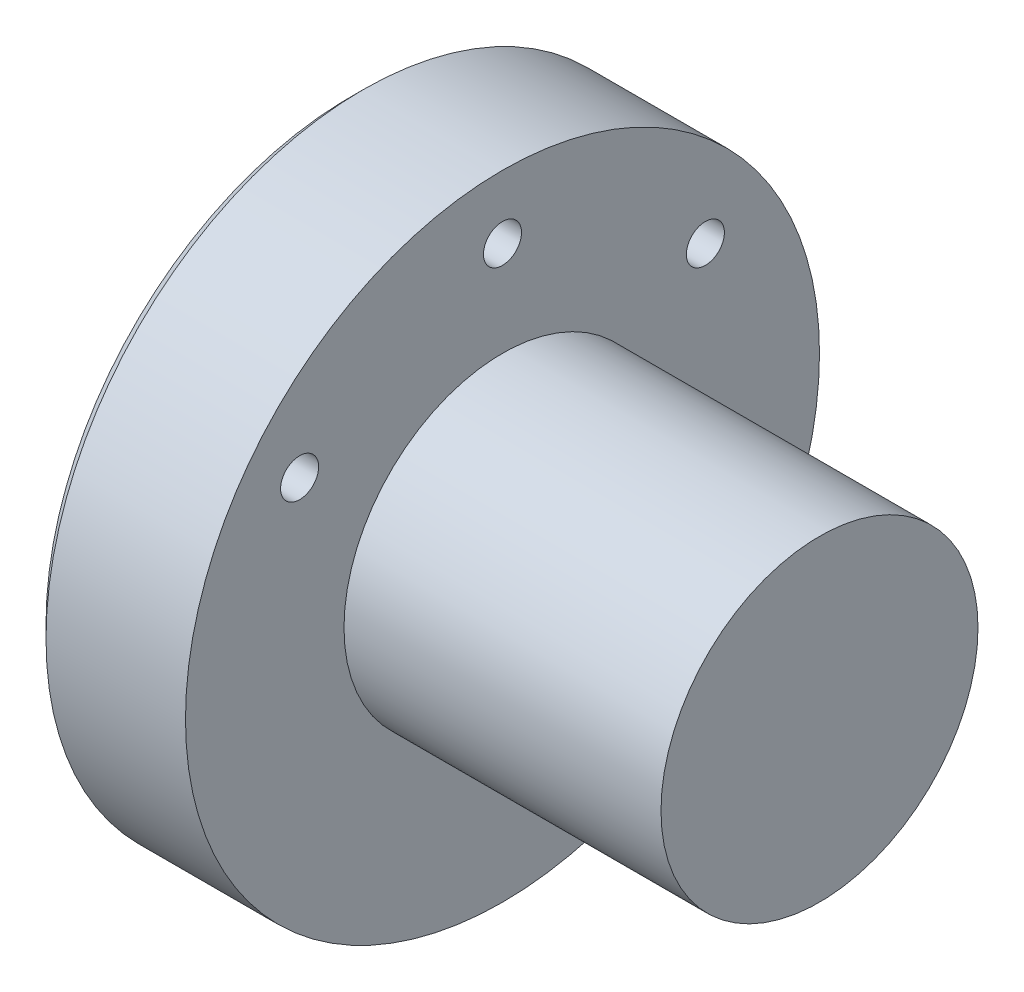
ISO-10303-21;
HEADER;
FILE_DESCRIPTION(('STEP AP214'),'2;1');
FILE_NAME('part.step','',(''),(''),'','','');
FILE_SCHEMA(('AUTOMOTIVE_DESIGN { 1 0 10303 214 1 1 1 1 }'));
ENDSEC;
DATA;
#1=APPLICATION_CONTEXT('core data for automotive mechanical design processes');
#2=APPLICATION_PROTOCOL_DEFINITION('international standard','automotive_design',2000,#1);
#3=PRODUCT_CONTEXT('',#1,'mechanical');
#4=PRODUCT('Part','Part','',(#3));
#5=PRODUCT_RELATED_PRODUCT_CATEGORY('part','',(#4));
#6=PRODUCT_DEFINITION_FORMATION('','',#4);
#7=PRODUCT_DEFINITION_CONTEXT('part definition',#1,'design');
#8=PRODUCT_DEFINITION('design','',#6,#7);
#9=PRODUCT_DEFINITION_SHAPE('','',#8);
#10=(LENGTH_UNIT() NAMED_UNIT(*) SI_UNIT(.MILLI.,.METRE.));
#11=(NAMED_UNIT(*) PLANE_ANGLE_UNIT() SI_UNIT($,.RADIAN.));
#12=(NAMED_UNIT(*) SI_UNIT($,.STERADIAN.) SOLID_ANGLE_UNIT());
#13=UNCERTAINTY_MEASURE_WITH_UNIT(LENGTH_MEASURE(1.E-05),#10,'distance_accuracy_value','');
#14=(GEOMETRIC_REPRESENTATION_CONTEXT(3) GLOBAL_UNCERTAINTY_ASSIGNED_CONTEXT((#13)) GLOBAL_UNIT_ASSIGNED_CONTEXT((#10,
#11,#12)) REPRESENTATION_CONTEXT('',''));
#15=CARTESIAN_POINT('',(0.,0.,0.));
#16=DIRECTION('',(0.,0.,1.));
#17=DIRECTION('',(1.,0.,0.));
#18=AXIS2_PLACEMENT_3D('',#15,#16,#17);
#19=CARTESIAN_POINT('',(0.,6.,0.));
#20=DIRECTION('',(1.,0.,0.));
#21=DIRECTION('',(0.,0.,-1.));
#22=AXIS2_PLACEMENT_3D('',#19,#20,#21);
#23=PLANE('',#22);
#24=CARTESIAN_POINT('',(0.,0.,0.));
#25=DIRECTION('',(1.,0.,0.));
#26=DIRECTION('',(0.,0.,-1.));
#27=AXIS2_PLACEMENT_3D('',#24,#25,#26);
#28=CIRCLE('',#27,5.);
#29=CARTESIAN_POINT('',(0.,0.,-5.));
#30=VERTEX_POINT('',#29);
#31=EDGE_CURVE('E80',#30,#30,#28,.F.);
#32=ORIENTED_EDGE('',*,*,#31,.T.);
#33=EDGE_LOOP('',(#32));
#34=FACE_BOUND('',#33,.T.);
#35=ADVANCED_FACE('F43',(#34),#23,.F.);
#36=CARTESIAN_POINT('',(40.,0.,0.));
#37=DIRECTION('',(-1.,0.,0.));
#38=DIRECTION('',(0.,0.,1.));
#39=AXIS2_PLACEMENT_3D('',#36,#37,#38);
#40=PLANE('',#39);
#41=CARTESIAN_POINT('',(40.,0.,0.));
#42=DIRECTION('',(-1.,0.,0.));
#43=DIRECTION('',(0.,0.,1.));
#44=AXIS2_PLACEMENT_3D('',#41,#42,#43);
#45=CIRCLE('',#44,12.5);
#46=CARTESIAN_POINT('',(40.,0.,12.5));
#47=VERTEX_POINT('',#46);
#48=EDGE_CURVE('E92',#47,#47,#45,.T.);
#49=ORIENTED_EDGE('',*,*,#48,.F.);
#50=EDGE_LOOP('',(#49));
#51=FACE_BOUND('',#50,.T.);
#52=ADVANCED_FACE('F141',(#51),#40,.F.);
#53=CARTESIAN_POINT('',(0.,0.,0.));
#54=DIRECTION('',(-1.,0.,0.));
#55=DIRECTION('',(0.,0.,1.));
#56=AXIS2_PLACEMENT_3D('',#53,#54,#55);
#57=CYLINDRICAL_SURFACE('',#56,12.5);
#58=CARTESIAN_POINT('',(15.,0.,0.));
#59=DIRECTION('',(-1.,0.,0.));
#60=DIRECTION('',(0.,0.,1.));
#61=AXIS2_PLACEMENT_3D('',#58,#59,#60);
#62=CIRCLE('',#61,12.5);
#63=CARTESIAN_POINT('',(15.,0.,12.5));
#64=VERTEX_POINT('',#63);
#65=EDGE_CURVE('E96',#64,#64,#62,.T.);
#66=ORIENTED_EDGE('',*,*,#65,.F.);
#67=EDGE_LOOP('',(#66));
#68=FACE_BOUND('',#67,.T.);
#69=ORIENTED_EDGE('',*,*,#48,.T.);
#70=EDGE_LOOP('',(#69));
#71=FACE_BOUND('',#70,.T.);
#72=ADVANCED_FACE('F147',(#68,#71),#57,.T.);
#73=CARTESIAN_POINT('',(15.,12.5,0.));
#74=DIRECTION('',(-1.,0.,0.));
#75=DIRECTION('',(0.,0.,1.));
#76=AXIS2_PLACEMENT_3D('',#73,#74,#75);
#77=PLANE('',#76);
#78=CARTESIAN_POINT('',(15.,12.,-16.));
#79=DIRECTION('',(-1.,0.,0.));
#80=DIRECTION('',(0.,0.,1.));
#81=AXIS2_PLACEMENT_3D('',#78,#79,#80);
#82=CIRCLE('',#81,1.5);
#83=CARTESIAN_POINT('',(15.,12.,-14.5));
#84=VERTEX_POINT('',#83);
#85=EDGE_CURVE('E108',#84,#84,#82,.T.);
#86=ORIENTED_EDGE('',*,*,#85,.T.);
#87=EDGE_LOOP('',(#86));
#88=FACE_BOUND('',#87,.T.);
#89=CARTESIAN_POINT('',(15.,20.,0.));
#90=DIRECTION('',(-1.,0.,0.));
#91=DIRECTION('',(0.,0.,1.));
#92=AXIS2_PLACEMENT_3D('',#89,#90,#91);
#93=CIRCLE('',#92,1.5);
#94=CARTESIAN_POINT('',(15.,20.,1.5));
#95=VERTEX_POINT('',#94);
#96=EDGE_CURVE('E112',#95,#95,#93,.T.);
#97=ORIENTED_EDGE('',*,*,#96,.T.);
#98=EDGE_LOOP('',(#97));
#99=FACE_BOUND('',#98,.T.);
#100=CARTESIAN_POINT('',(15.,12.,16.));
#101=DIRECTION('',(-1.,0.,0.));
#102=DIRECTION('',(0.,0.,1.));
#103=AXIS2_PLACEMENT_3D('',#100,#101,#102);
#104=CIRCLE('',#103,1.5);
#105=CARTESIAN_POINT('',(15.,12.,17.5));
#106=VERTEX_POINT('',#105);
#107=EDGE_CURVE('E116',#106,#106,#104,.T.);
#108=ORIENTED_EDGE('',*,*,#107,.T.);
#109=EDGE_LOOP('',(#108));
#110=FACE_BOUND('',#109,.T.);
#111=CARTESIAN_POINT('',(15.,0.,0.));
#112=DIRECTION('',(-1.,0.,0.));
#113=DIRECTION('',(0.,0.,1.));
#114=AXIS2_PLACEMENT_3D('',#111,#112,#113);
#115=CIRCLE('',#114,25.);
#116=CARTESIAN_POINT('',(15.,0.,25.));
#117=VERTEX_POINT('',#116);
#118=EDGE_CURVE('E100',#117,#117,#115,.T.);
#119=ORIENTED_EDGE('',*,*,#118,.F.);
#120=EDGE_LOOP('',(#119));
#121=FACE_BOUND('',#120,.T.);
#122=ORIENTED_EDGE('',*,*,#65,.T.);
#123=EDGE_LOOP('',(#122));
#124=FACE_BOUND('',#123,.T.);
#125=ADVANCED_FACE('F121',(#88,#99,#110,#121,#124),#77,.F.);
#126=CARTESIAN_POINT('',(0.,0.,0.));
#127=DIRECTION('',(-1.,0.,0.));
#128=DIRECTION('',(0.,0.,1.));
#129=AXIS2_PLACEMENT_3D('',#126,#127,#128);
#130=CYLINDRICAL_SURFACE('',#129,25.);
#131=CARTESIAN_POINT('',(4.00000000000001,0.,0.));
#132=DIRECTION('',(1.,0.,0.));
#133=DIRECTION('',(0.,0.,-1.));
#134=AXIS2_PLACEMENT_3D('',#131,#132,#133);
#135=CIRCLE('',#134,25.);
#136=CARTESIAN_POINT('',(4.00000000000001,0.,-25.));
#137=VERTEX_POINT('',#136);
#138=EDGE_CURVE('E84',#137,#137,#135,.T.);
#139=ORIENTED_EDGE('',*,*,#138,.T.);
#140=EDGE_LOOP('',(#139));
#141=FACE_BOUND('',#140,.T.);
#142=ORIENTED_EDGE('',*,*,#118,.T.);
#143=EDGE_LOOP('',(#142));
#144=FACE_BOUND('',#143,.T.);
#145=ADVANCED_FACE('F184',(#141,#144),#130,.T.);
#146=CARTESIAN_POINT('',(3.,25.,0.));
#147=DIRECTION('',(1.,0.,0.));
#148=DIRECTION('',(0.,0.,-1.));
#149=AXIS2_PLACEMENT_3D('',#146,#147,#148);
#150=PLANE('',#149);
#151=CARTESIAN_POINT('',(3.,12.,16.));
#152=DIRECTION('',(1.,0.,0.));
#153=DIRECTION('',(0.,0.,-1.));
#154=AXIS2_PLACEMENT_3D('',#151,#152,#153);
#155=CIRCLE('',#154,2.);
#156=CARTESIAN_POINT('',(3.,12.,14.));
#157=VERTEX_POINT('',#156);
#158=EDGE_CURVE('E57',#157,#157,#155,.T.);
#159=ORIENTED_EDGE('',*,*,#158,.T.);
#160=EDGE_LOOP('',(#159));
#161=FACE_BOUND('',#160,.T.);
#162=CARTESIAN_POINT('',(3.,20.,0.));
#163=DIRECTION('',(1.,0.,0.));
#164=DIRECTION('',(0.,0.,-1.));
#165=AXIS2_PLACEMENT_3D('',#162,#163,#164);
#166=CIRCLE('',#165,2.);
#167=CARTESIAN_POINT('',(3.,20.,-2.));
#168=VERTEX_POINT('',#167);
#169=EDGE_CURVE('E62',#168,#168,#166,.T.);
#170=ORIENTED_EDGE('',*,*,#169,.T.);
#171=EDGE_LOOP('',(#170));
#172=FACE_BOUND('',#171,.T.);
#173=CARTESIAN_POINT('',(3.,12.,-16.));
#174=DIRECTION('',(1.,0.,0.));
#175=DIRECTION('',(0.,0.,-1.));
#176=AXIS2_PLACEMENT_3D('',#173,#174,#175);
#177=CIRCLE('',#176,2.);
#178=CARTESIAN_POINT('',(3.,12.,-18.));
#179=VERTEX_POINT('',#178);
#180=EDGE_CURVE('E68',#179,#179,#177,.T.);
#181=ORIENTED_EDGE('',*,*,#180,.T.);
#182=EDGE_LOOP('',(#181));
#183=FACE_BOUND('',#182,.T.);
#184=CARTESIAN_POINT('',(3.,0.,0.));
#185=DIRECTION('',(1.,0.,0.));
#186=DIRECTION('',(0.,0.,-1.));
#187=AXIS2_PLACEMENT_3D('',#184,#185,#186);
#188=CIRCLE('',#187,24.);
#189=CARTESIAN_POINT('',(3.,0.,-24.));
#190=VERTEX_POINT('',#189);
#191=EDGE_CURVE('E88',#190,#190,#188,.F.);
#192=ORIENTED_EDGE('',*,*,#191,.T.);
#193=EDGE_LOOP('',(#192));
#194=FACE_BOUND('',#193,.T.);
#195=CARTESIAN_POINT('',(3.,0.,0.));
#196=DIRECTION('',(-1.,0.,0.));
#197=DIRECTION('',(0.,0.,1.));
#198=AXIS2_PLACEMENT_3D('',#195,#196,#197);
#199=CIRCLE('',#198,6.);
#200=CARTESIAN_POINT('',(3.,0.,6.));
#201=VERTEX_POINT('',#200);
#202=EDGE_CURVE('E104',#201,#201,#199,.T.);
#203=ORIENTED_EDGE('',*,*,#202,.F.);
#204=EDGE_LOOP('',(#203));
#205=FACE_BOUND('',#204,.T.);
#206=ADVANCED_FACE('F181',(#161,#172,#183,#194,#205),#150,.F.);
#207=CARTESIAN_POINT('',(0.,0.,0.));
#208=DIRECTION('',(-1.,0.,0.));
#209=DIRECTION('',(0.,0.,1.));
#210=AXIS2_PLACEMENT_3D('',#207,#208,#209);
#211=CYLINDRICAL_SURFACE('',#210,6.);
#212=CARTESIAN_POINT('',(0.999999999999996,0.,0.));
#213=DIRECTION('',(1.,0.,0.));
#214=DIRECTION('',(0.,0.,-1.));
#215=AXIS2_PLACEMENT_3D('',#212,#213,#214);
#216=CIRCLE('',#215,6.);
#217=CARTESIAN_POINT('',(0.999999999999996,0.,-6.));
#218=VERTEX_POINT('',#217);
#219=EDGE_CURVE('E76',#218,#218,#216,.T.);
#220=ORIENTED_EDGE('',*,*,#219,.T.);
#221=EDGE_LOOP('',(#220));
#222=FACE_BOUND('',#221,.T.);
#223=ORIENTED_EDGE('',*,*,#202,.T.);
#224=EDGE_LOOP('',(#223));
#225=FACE_BOUND('',#224,.T.);
#226=ADVANCED_FACE('F157',(#222,#225),#211,.T.);
#227=CARTESIAN_POINT('',(3.,0.,0.));
#228=DIRECTION('',(1.,0.,0.));
#229=DIRECTION('',(0.,0.,-1.));
#230=AXIS2_PLACEMENT_3D('',#227,#228,#229);
#231=CONICAL_SURFACE('',#230,24.,0.78539816339745);
#232=ORIENTED_EDGE('',*,*,#138,.F.);
#233=EDGE_LOOP('',(#232));
#234=FACE_BOUND('',#233,.T.);
#235=ORIENTED_EDGE('',*,*,#191,.F.);
#236=EDGE_LOOP('',(#235));
#237=FACE_BOUND('',#236,.T.);
#238=ADVANCED_FACE('F136',(#234,#237),#231,.T.);
#239=CARTESIAN_POINT('',(0.,0.,0.));
#240=DIRECTION('',(1.,0.,0.));
#241=DIRECTION('',(0.,0.,-1.));
#242=AXIS2_PLACEMENT_3D('',#239,#240,#241);
#243=CONICAL_SURFACE('',#242,5.,0.785398163397448);
#244=ORIENTED_EDGE('',*,*,#219,.F.);
#245=EDGE_LOOP('',(#244));
#246=FACE_BOUND('',#245,.T.);
#247=ORIENTED_EDGE('',*,*,#31,.F.);
#248=EDGE_LOOP('',(#247));
#249=FACE_BOUND('',#248,.T.);
#250=ADVANCED_FACE('F127',(#246,#249),#243,.T.);
#251=CARTESIAN_POINT('',(40.,12.,16.));
#252=DIRECTION('',(-1.,0.,0.));
#253=DIRECTION('',(0.,0.,1.));
#254=AXIS2_PLACEMENT_3D('',#251,#252,#253);
#255=CYLINDRICAL_SURFACE('',#254,1.5);
#256=CARTESIAN_POINT('',(3.5,12.,16.));
#257=DIRECTION('',(1.,0.,0.));
#258=DIRECTION('',(0.,0.,-1.));
#259=AXIS2_PLACEMENT_3D('',#256,#257,#258);
#260=CIRCLE('',#259,1.5);
#261=CARTESIAN_POINT('',(3.5,12.,14.5));
#262=VERTEX_POINT('',#261);
#263=EDGE_CURVE('E72',#262,#262,#260,.F.);
#264=ORIENTED_EDGE('',*,*,#263,.T.);
#265=EDGE_LOOP('',(#264));
#266=FACE_BOUND('',#265,.T.);
#267=ORIENTED_EDGE('',*,*,#107,.F.);
#268=EDGE_LOOP('',(#267));
#269=FACE_BOUND('',#268,.T.);
#270=ADVANCED_FACE('F124',(#266,#269),#255,.F.);
#271=CARTESIAN_POINT('',(40.,20.,0.));
#272=DIRECTION('',(-1.,0.,0.));
#273=DIRECTION('',(0.,0.,1.));
#274=AXIS2_PLACEMENT_3D('',#271,#272,#273);
#275=CYLINDRICAL_SURFACE('',#274,1.5);
#276=CARTESIAN_POINT('',(3.5,20.,0.));
#277=DIRECTION('',(1.,0.,0.));
#278=DIRECTION('',(0.,0.,-1.));
#279=AXIS2_PLACEMENT_3D('',#276,#277,#278);
#280=CIRCLE('',#279,1.5);
#281=CARTESIAN_POINT('',(3.5,20.,-1.5));
#282=VERTEX_POINT('',#281);
#283=EDGE_CURVE('E52',#282,#282,#280,.F.);
#284=ORIENTED_EDGE('',*,*,#283,.T.);
#285=EDGE_LOOP('',(#284));
#286=FACE_BOUND('',#285,.T.);
#287=ORIENTED_EDGE('',*,*,#96,.F.);
#288=EDGE_LOOP('',(#287));
#289=FACE_BOUND('',#288,.T.);
#290=ADVANCED_FACE('F126',(#286,#289),#275,.F.);
#291=CARTESIAN_POINT('',(40.,12.,-16.));
#292=DIRECTION('',(-1.,0.,0.));
#293=DIRECTION('',(0.,0.,1.));
#294=AXIS2_PLACEMENT_3D('',#291,#292,#293);
#295=CYLINDRICAL_SURFACE('',#294,1.5);
#296=CARTESIAN_POINT('',(3.5,12.,-16.));
#297=DIRECTION('',(1.,0.,0.));
#298=DIRECTION('',(0.,0.,-1.));
#299=AXIS2_PLACEMENT_3D('',#296,#297,#298);
#300=CIRCLE('',#299,1.5);
#301=CARTESIAN_POINT('',(3.5,12.,-17.5));
#302=VERTEX_POINT('',#301);
#303=EDGE_CURVE('E10',#302,#302,#300,.F.);
#304=ORIENTED_EDGE('',*,*,#303,.T.);
#305=EDGE_LOOP('',(#304));
#306=FACE_BOUND('',#305,.T.);
#307=ORIENTED_EDGE('',*,*,#85,.F.);
#308=EDGE_LOOP('',(#307));
#309=FACE_BOUND('',#308,.T.);
#310=ADVANCED_FACE('F134',(#306,#309),#295,.F.);
#311=CARTESIAN_POINT('',(3.5,12.,16.));
#312=DIRECTION('',(-1.,0.,0.));
#313=DIRECTION('',(0.,0.,1.));
#314=AXIS2_PLACEMENT_3D('',#311,#312,#313);
#315=CONICAL_SURFACE('',#314,1.5,0.785398163397442);
#316=ORIENTED_EDGE('',*,*,#158,.F.);
#317=EDGE_LOOP('',(#316));
#318=FACE_BOUND('',#317,.T.);
#319=ORIENTED_EDGE('',*,*,#263,.F.);
#320=EDGE_LOOP('',(#319));
#321=FACE_BOUND('',#320,.T.);
#322=ADVANCED_FACE('F163',(#318,#321),#315,.F.);
#323=CARTESIAN_POINT('',(3.5,20.,0.));
#324=DIRECTION('',(-1.,0.,0.));
#325=DIRECTION('',(0.,0.,1.));
#326=AXIS2_PLACEMENT_3D('',#323,#324,#325);
#327=CONICAL_SURFACE('',#326,1.5,0.785398163397442);
#328=ORIENTED_EDGE('',*,*,#169,.F.);
#329=EDGE_LOOP('',(#328));
#330=FACE_BOUND('',#329,.T.);
#331=ORIENTED_EDGE('',*,*,#283,.F.);
#332=EDGE_LOOP('',(#331));
#333=FACE_BOUND('',#332,.T.);
#334=ADVANCED_FACE('F168',(#330,#333),#327,.F.);
#335=CARTESIAN_POINT('',(3.5,12.,-16.));
#336=DIRECTION('',(-1.,0.,0.));
#337=DIRECTION('',(0.,0.,1.));
#338=AXIS2_PLACEMENT_3D('',#335,#336,#337);
#339=CONICAL_SURFACE('',#338,1.5,0.785398163397442);
#340=ORIENTED_EDGE('',*,*,#180,.F.);
#341=EDGE_LOOP('',(#340));
#342=FACE_BOUND('',#341,.T.);
#343=ORIENTED_EDGE('',*,*,#303,.F.);
#344=EDGE_LOOP('',(#343));
#345=FACE_BOUND('',#344,.T.);
#346=ADVANCED_FACE('F46',(#342,#345),#339,.F.);
#347=CLOSED_SHELL('',(#35,#52,#72,#125,#145,#206,#226,#238,#250,#270,#290,#310,#322,#334,#346));
#348=MANIFOLD_SOLID_BREP('B2',#347);
#349=ADVANCED_BREP_SHAPE_REPRESENTATION('',(#18,#348),#14);
#350=SHAPE_DEFINITION_REPRESENTATION(#9,#349);
ENDSEC;
END-ISO-10303-21;
